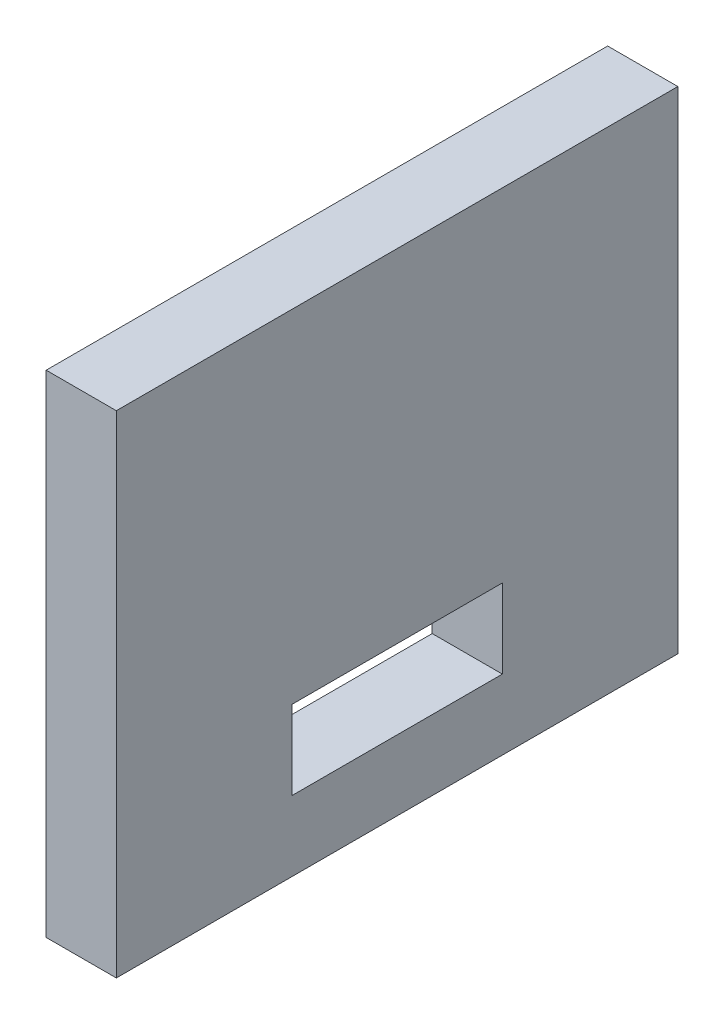
ISO-10303-21;
HEADER;
FILE_DESCRIPTION(('STEP AP214'),'2;1');
FILE_NAME('part.step','',(''),(''),'','','');
FILE_SCHEMA(('AUTOMOTIVE_DESIGN { 1 0 10303 214 1 1 1 1 }'));
ENDSEC;
DATA;
#1=APPLICATION_CONTEXT('core data for automotive mechanical design processes');
#2=APPLICATION_PROTOCOL_DEFINITION('international standard','automotive_design',2000,#1);
#3=PRODUCT_CONTEXT('',#1,'mechanical');
#4=PRODUCT('Part','Part','',(#3));
#5=PRODUCT_RELATED_PRODUCT_CATEGORY('part','',(#4));
#6=PRODUCT_DEFINITION_FORMATION('','',#4);
#7=PRODUCT_DEFINITION_CONTEXT('part definition',#1,'design');
#8=PRODUCT_DEFINITION('design','',#6,#7);
#9=PRODUCT_DEFINITION_SHAPE('','',#8);
#10=(LENGTH_UNIT() NAMED_UNIT(*) SI_UNIT(.MILLI.,.METRE.));
#11=(NAMED_UNIT(*) PLANE_ANGLE_UNIT() SI_UNIT($,.RADIAN.));
#12=(NAMED_UNIT(*) SI_UNIT($,.STERADIAN.) SOLID_ANGLE_UNIT());
#13=UNCERTAINTY_MEASURE_WITH_UNIT(LENGTH_MEASURE(1.E-05),#10,'distance_accuracy_value','');
#14=(GEOMETRIC_REPRESENTATION_CONTEXT(3) GLOBAL_UNCERTAINTY_ASSIGNED_CONTEXT((#13)) GLOBAL_UNIT_ASSIGNED_CONTEXT((#10,
#11,#12)) REPRESENTATION_CONTEXT('',''));
#15=CARTESIAN_POINT('',(0.,0.,0.));
#16=DIRECTION('',(0.,0.,1.));
#17=DIRECTION('',(1.,0.,0.));
#18=AXIS2_PLACEMENT_3D('',#15,#16,#17);
#19=CARTESIAN_POINT('',(3.175,0.,0.));
#20=DIRECTION('',(-1.,0.,0.));
#21=DIRECTION('',(0.,0.,1.));
#22=AXIS2_PLACEMENT_3D('',#19,#20,#21);
#23=PLANE('',#22);
#24=DIRECTION('',(0.,-1.,0.));
#25=VECTOR('',#24,1.);
#26=CARTESIAN_POINT('',(3.175,0.,0.));
#27=LINE('',#26,#25);
#28=CARTESIAN_POINT('',(3.175,22.225,0.));
#29=VERTEX_POINT('',#28);
#30=CARTESIAN_POINT('',(3.175,0.,0.));
#31=VERTEX_POINT('',#30);
#32=EDGE_CURVE('E134',#29,#31,#27,.T.);
#33=ORIENTED_EDGE('',*,*,#32,.T.);
#34=DIRECTION('',(0.,0.,-1.));
#35=VECTOR('',#34,1.);
#36=CARTESIAN_POINT('',(3.175,0.,0.));
#37=LINE('',#36,#35);
#38=CARTESIAN_POINT('',(3.175,0.,-25.4));
#39=VERTEX_POINT('',#38);
#40=EDGE_CURVE('E137',#31,#39,#37,.T.);
#41=ORIENTED_EDGE('',*,*,#40,.T.);
#42=DIRECTION('',(0.,1.,0.));
#43=VECTOR('',#42,1.);
#44=CARTESIAN_POINT('',(3.175,0.,-25.4));
#45=LINE('',#44,#43);
#46=CARTESIAN_POINT('',(3.175,22.225,-25.4));
#47=VERTEX_POINT('',#46);
#48=EDGE_CURVE('E140',#39,#47,#45,.T.);
#49=ORIENTED_EDGE('',*,*,#48,.T.);
#50=DIRECTION('',(0.,0.,1.));
#51=VECTOR('',#50,1.);
#52=CARTESIAN_POINT('',(3.175,22.225,0.));
#53=LINE('',#52,#51);
#54=EDGE_CURVE('E142',#47,#29,#53,.T.);
#55=ORIENTED_EDGE('',*,*,#54,.T.);
#56=EDGE_LOOP('',(#33,#41,#49,#55));
#57=FACE_BOUND('',#56,.T.);
#58=DIRECTION('',(0.,-1.,0.));
#59=VECTOR('',#58,1.);
#60=CARTESIAN_POINT('',(3.175,6.746875,-7.9375));
#61=LINE('',#60,#59);
#62=CARTESIAN_POINT('',(3.175,6.746875,-7.9375));
#63=VERTEX_POINT('',#62);
#64=CARTESIAN_POINT('',(3.175,3.175,-7.9375));
#65=VERTEX_POINT('',#64);
#66=EDGE_CURVE('E98',#63,#65,#61,.T.);
#67=ORIENTED_EDGE('',*,*,#66,.F.);
#68=DIRECTION('',(0.,0.,1.));
#69=VECTOR('',#68,1.);
#70=CARTESIAN_POINT('',(3.175,6.746875,-7.9375));
#71=LINE('',#70,#69);
#72=CARTESIAN_POINT('',(3.175,6.746875,-17.4625));
#73=VERTEX_POINT('',#72);
#74=EDGE_CURVE('E120',#73,#63,#71,.T.);
#75=ORIENTED_EDGE('',*,*,#74,.F.);
#76=DIRECTION('',(0.,1.,0.));
#77=VECTOR('',#76,1.);
#78=CARTESIAN_POINT('',(3.175,6.746875,-17.4625));
#79=LINE('',#78,#77);
#80=CARTESIAN_POINT('',(3.175,3.175,-17.4625));
#81=VERTEX_POINT('',#80);
#82=EDGE_CURVE('E118',#81,#73,#79,.T.);
#83=ORIENTED_EDGE('',*,*,#82,.F.);
#84=DIRECTION('',(0.,0.,-1.));
#85=VECTOR('',#84,1.);
#86=CARTESIAN_POINT('',(3.175,3.175,-7.9375));
#87=LINE('',#86,#85);
#88=EDGE_CURVE('E106',#65,#81,#87,.T.);
#89=ORIENTED_EDGE('',*,*,#88,.F.);
#90=EDGE_LOOP('',(#67,#75,#83,#89));
#91=FACE_BOUND('',#90,.T.);
#92=ADVANCED_FACE('F33',(#57,#91),#23,.F.);
#93=CARTESIAN_POINT('',(0.,0.,0.));
#94=DIRECTION('',(-1.,0.,0.));
#95=DIRECTION('',(0.,0.,1.));
#96=AXIS2_PLACEMENT_3D('',#93,#94,#95);
#97=PLANE('',#96);
#98=DIRECTION('',(0.,-1.,0.));
#99=VECTOR('',#98,1.);
#100=CARTESIAN_POINT('',(0.,0.,0.));
#101=LINE('',#100,#99);
#102=CARTESIAN_POINT('',(0.,22.225,0.));
#103=VERTEX_POINT('',#102);
#104=CARTESIAN_POINT('',(0.,0.,0.));
#105=VERTEX_POINT('',#104);
#106=EDGE_CURVE('E114',#103,#105,#101,.T.);
#107=ORIENTED_EDGE('',*,*,#106,.F.);
#108=DIRECTION('',(0.,0.,1.));
#109=VECTOR('',#108,1.);
#110=CARTESIAN_POINT('',(0.,22.225,0.));
#111=LINE('',#110,#109);
#112=CARTESIAN_POINT('',(0.,22.225,-25.4));
#113=VERTEX_POINT('',#112);
#114=EDGE_CURVE('E138',#113,#103,#111,.T.);
#115=ORIENTED_EDGE('',*,*,#114,.F.);
#116=DIRECTION('',(0.,1.,0.));
#117=VECTOR('',#116,1.);
#118=CARTESIAN_POINT('',(0.,0.,-25.4));
#119=LINE('',#118,#117);
#120=CARTESIAN_POINT('',(0.,0.,-25.4));
#121=VERTEX_POINT('',#120);
#122=EDGE_CURVE('E149',#121,#113,#119,.T.);
#123=ORIENTED_EDGE('',*,*,#122,.F.);
#124=DIRECTION('',(0.,0.,-1.));
#125=VECTOR('',#124,1.);
#126=CARTESIAN_POINT('',(0.,0.,0.));
#127=LINE('',#126,#125);
#128=EDGE_CURVE('E147',#105,#121,#127,.T.);
#129=ORIENTED_EDGE('',*,*,#128,.F.);
#130=EDGE_LOOP('',(#107,#115,#123,#129));
#131=FACE_BOUND('',#130,.T.);
#132=DIRECTION('',(0.,0.,1.));
#133=VECTOR('',#132,1.);
#134=CARTESIAN_POINT('',(0.,6.746875,-7.9375));
#135=LINE('',#134,#133);
#136=CARTESIAN_POINT('',(0.,6.746875,-17.4625));
#137=VERTEX_POINT('',#136);
#138=CARTESIAN_POINT('',(0.,6.746875,-7.9375));
#139=VERTEX_POINT('',#138);
#140=EDGE_CURVE('E107',#137,#139,#135,.T.);
#141=ORIENTED_EDGE('',*,*,#140,.T.);
#142=DIRECTION('',(0.,-1.,0.));
#143=VECTOR('',#142,1.);
#144=CARTESIAN_POINT('',(0.,6.746875,-7.9375));
#145=LINE('',#144,#143);
#146=CARTESIAN_POINT('',(0.,3.175,-7.9375));
#147=VERTEX_POINT('',#146);
#148=EDGE_CURVE('E56',#139,#147,#145,.T.);
#149=ORIENTED_EDGE('',*,*,#148,.T.);
#150=DIRECTION('',(0.,0.,-1.));
#151=VECTOR('',#150,1.);
#152=CARTESIAN_POINT('',(0.,3.175,-7.9375));
#153=LINE('',#152,#151);
#154=CARTESIAN_POINT('',(0.,3.175,-17.4625));
#155=VERTEX_POINT('',#154);
#156=EDGE_CURVE('E113',#147,#155,#153,.T.);
#157=ORIENTED_EDGE('',*,*,#156,.T.);
#158=DIRECTION('',(0.,1.,0.));
#159=VECTOR('',#158,1.);
#160=CARTESIAN_POINT('',(0.,6.746875,-17.4625));
#161=LINE('',#160,#159);
#162=EDGE_CURVE('E126',#155,#137,#161,.T.);
#163=ORIENTED_EDGE('',*,*,#162,.T.);
#164=EDGE_LOOP('',(#141,#149,#157,#163));
#165=FACE_BOUND('',#164,.T.);
#166=ADVANCED_FACE('F167',(#131,#165),#97,.T.);
#167=CARTESIAN_POINT('',(3.175,0.,0.));
#168=DIRECTION('',(0.,0.,-1.));
#169=DIRECTION('',(-1.,0.,0.));
#170=AXIS2_PLACEMENT_3D('',#167,#168,#169);
#171=PLANE('',#170);
#172=ORIENTED_EDGE('',*,*,#106,.T.);
#173=DIRECTION('',(-1.,0.,0.));
#174=VECTOR('',#173,1.);
#175=CARTESIAN_POINT('',(3.175,0.,0.));
#176=LINE('',#175,#174);
#177=EDGE_CURVE('E11',#31,#105,#176,.T.);
#178=ORIENTED_EDGE('',*,*,#177,.F.);
#179=ORIENTED_EDGE('',*,*,#32,.F.);
#180=DIRECTION('',(-1.,0.,0.));
#181=VECTOR('',#180,1.);
#182=CARTESIAN_POINT('',(3.175,22.225,0.));
#183=LINE('',#182,#181);
#184=EDGE_CURVE('E144',#29,#103,#183,.T.);
#185=ORIENTED_EDGE('',*,*,#184,.T.);
#186=EDGE_LOOP('',(#172,#178,#179,#185));
#187=FACE_BOUND('',#186,.T.);
#188=ADVANCED_FACE('F35',(#187),#171,.F.);
#189=CARTESIAN_POINT('',(3.175,0.,0.));
#190=DIRECTION('',(0.,1.,0.));
#191=DIRECTION('',(0.,0.,1.));
#192=AXIS2_PLACEMENT_3D('',#189,#190,#191);
#193=PLANE('',#192);
#194=ORIENTED_EDGE('',*,*,#128,.T.);
#195=DIRECTION('',(-1.,0.,0.));
#196=VECTOR('',#195,1.);
#197=CARTESIAN_POINT('',(3.175,0.,-25.4));
#198=LINE('',#197,#196);
#199=EDGE_CURVE('E41',#39,#121,#198,.T.);
#200=ORIENTED_EDGE('',*,*,#199,.F.);
#201=ORIENTED_EDGE('',*,*,#40,.F.);
#202=ORIENTED_EDGE('',*,*,#177,.T.);
#203=EDGE_LOOP('',(#194,#200,#201,#202));
#204=FACE_BOUND('',#203,.T.);
#205=ADVANCED_FACE('F177',(#204),#193,.F.);
#206=CARTESIAN_POINT('',(3.175,0.,-25.4));
#207=DIRECTION('',(0.,0.,1.));
#208=DIRECTION('',(0.,-1.,0.));
#209=AXIS2_PLACEMENT_3D('',#206,#207,#208);
#210=PLANE('',#209);
#211=ORIENTED_EDGE('',*,*,#122,.T.);
#212=DIRECTION('',(-1.,0.,0.));
#213=VECTOR('',#212,1.);
#214=CARTESIAN_POINT('',(3.175,22.225,-25.4));
#215=LINE('',#214,#213);
#216=EDGE_CURVE('E154',#47,#113,#215,.T.);
#217=ORIENTED_EDGE('',*,*,#216,.F.);
#218=ORIENTED_EDGE('',*,*,#48,.F.);
#219=ORIENTED_EDGE('',*,*,#199,.T.);
#220=EDGE_LOOP('',(#211,#217,#218,#219));
#221=FACE_BOUND('',#220,.T.);
#222=ADVANCED_FACE('F161',(#221),#210,.F.);
#223=CARTESIAN_POINT('',(3.175,22.225,0.));
#224=DIRECTION('',(0.,-1.,0.));
#225=DIRECTION('',(0.,0.,-1.));
#226=AXIS2_PLACEMENT_3D('',#223,#224,#225);
#227=PLANE('',#226);
#228=ORIENTED_EDGE('',*,*,#114,.T.);
#229=ORIENTED_EDGE('',*,*,#184,.F.);
#230=ORIENTED_EDGE('',*,*,#54,.F.);
#231=ORIENTED_EDGE('',*,*,#216,.T.);
#232=EDGE_LOOP('',(#228,#229,#230,#231));
#233=FACE_BOUND('',#232,.T.);
#234=ADVANCED_FACE('F171',(#233),#227,.F.);
#235=CARTESIAN_POINT('',(3.175,6.746875,-7.9375));
#236=DIRECTION('',(0.,0.,-1.));
#237=DIRECTION('',(0.,1.,0.));
#238=AXIS2_PLACEMENT_3D('',#235,#236,#237);
#239=PLANE('',#238);
#240=ORIENTED_EDGE('',*,*,#148,.F.);
#241=DIRECTION('',(-1.,0.,0.));
#242=VECTOR('',#241,1.);
#243=CARTESIAN_POINT('',(3.175,6.746875,-7.9375));
#244=LINE('',#243,#242);
#245=EDGE_CURVE('E102',#63,#139,#244,.T.);
#246=ORIENTED_EDGE('',*,*,#245,.F.);
#247=ORIENTED_EDGE('',*,*,#66,.T.);
#248=DIRECTION('',(-1.,0.,0.));
#249=VECTOR('',#248,1.);
#250=CARTESIAN_POINT('',(3.175,3.175,-7.9375));
#251=LINE('',#250,#249);
#252=EDGE_CURVE('E101',#65,#147,#251,.T.);
#253=ORIENTED_EDGE('',*,*,#252,.T.);
#254=EDGE_LOOP('',(#240,#246,#247,#253));
#255=FACE_BOUND('',#254,.T.);
#256=ADVANCED_FACE('F100',(#255),#239,.T.);
#257=CARTESIAN_POINT('',(3.175,3.175,-7.9375));
#258=DIRECTION('',(0.,1.,0.));
#259=DIRECTION('',(0.,0.,1.));
#260=AXIS2_PLACEMENT_3D('',#257,#258,#259);
#261=PLANE('',#260);
#262=ORIENTED_EDGE('',*,*,#156,.F.);
#263=ORIENTED_EDGE('',*,*,#252,.F.);
#264=ORIENTED_EDGE('',*,*,#88,.T.);
#265=DIRECTION('',(-1.,0.,0.));
#266=VECTOR('',#265,1.);
#267=CARTESIAN_POINT('',(3.175,3.175,-17.4625));
#268=LINE('',#267,#266);
#269=EDGE_CURVE('E115',#81,#155,#268,.T.);
#270=ORIENTED_EDGE('',*,*,#269,.T.);
#271=EDGE_LOOP('',(#262,#263,#264,#270));
#272=FACE_BOUND('',#271,.T.);
#273=ADVANCED_FACE('F110',(#272),#261,.T.);
#274=CARTESIAN_POINT('',(3.175,6.746875,-17.4625));
#275=DIRECTION('',(0.,0.,1.));
#276=DIRECTION('',(1.,0.,0.));
#277=AXIS2_PLACEMENT_3D('',#274,#275,#276);
#278=PLANE('',#277);
#279=ORIENTED_EDGE('',*,*,#162,.F.);
#280=ORIENTED_EDGE('',*,*,#269,.F.);
#281=ORIENTED_EDGE('',*,*,#82,.T.);
#282=DIRECTION('',(-1.,0.,0.));
#283=VECTOR('',#282,1.);
#284=CARTESIAN_POINT('',(3.175,6.746875,-17.4625));
#285=LINE('',#284,#283);
#286=EDGE_CURVE('E48',#73,#137,#285,.T.);
#287=ORIENTED_EDGE('',*,*,#286,.T.);
#288=EDGE_LOOP('',(#279,#280,#281,#287));
#289=FACE_BOUND('',#288,.T.);
#290=ADVANCED_FACE('F200',(#289),#278,.T.);
#291=CARTESIAN_POINT('',(3.175,6.746875,-7.9375));
#292=DIRECTION('',(0.,-1.,0.));
#293=DIRECTION('',(0.,0.,-1.));
#294=AXIS2_PLACEMENT_3D('',#291,#292,#293);
#295=PLANE('',#294);
#296=ORIENTED_EDGE('',*,*,#140,.F.);
#297=ORIENTED_EDGE('',*,*,#286,.F.);
#298=ORIENTED_EDGE('',*,*,#74,.T.);
#299=ORIENTED_EDGE('',*,*,#245,.T.);
#300=EDGE_LOOP('',(#296,#297,#298,#299));
#301=FACE_BOUND('',#300,.T.);
#302=ADVANCED_FACE('F204',(#301),#295,.T.);
#303=CLOSED_SHELL('',(#92,#166,#188,#205,#222,#234,#256,#273,#290,#302));
#304=MANIFOLD_SOLID_BREP('B2',#303);
#305=ADVANCED_BREP_SHAPE_REPRESENTATION('',(#18,#304),#14);
#306=SHAPE_DEFINITION_REPRESENTATION(#9,#305);
ENDSEC;
END-ISO-10303-21;
